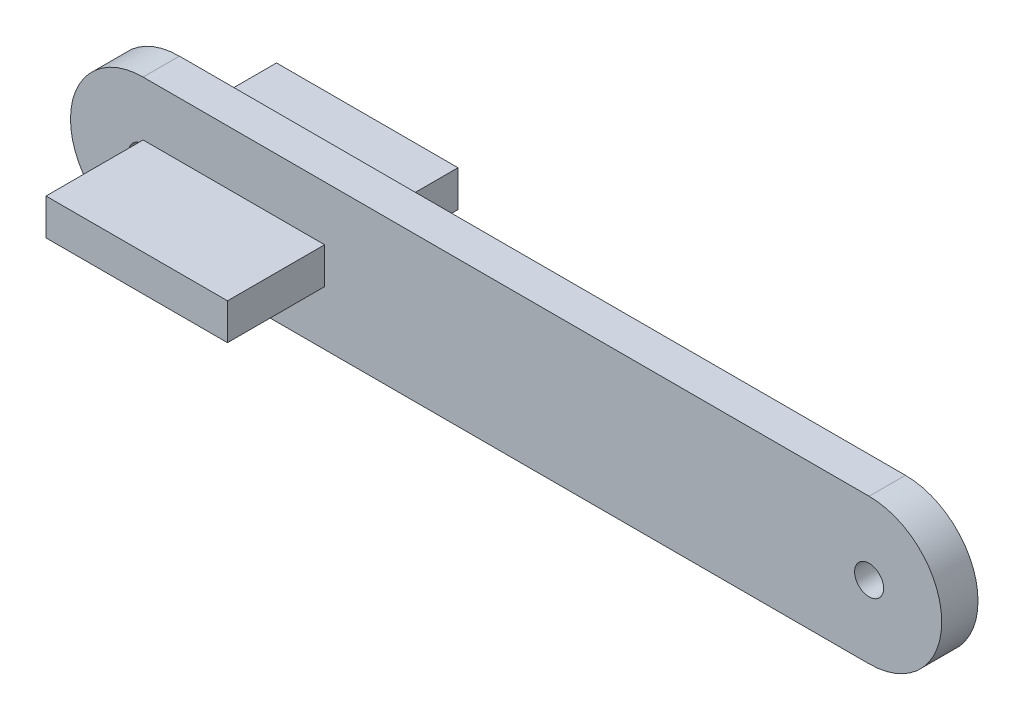
ISO-10303-21;
HEADER;
FILE_DESCRIPTION(('STEP AP214'),'2;1');
FILE_NAME('part.step','',(''),(''),'','','');
FILE_SCHEMA(('AUTOMOTIVE_DESIGN { 1 0 10303 214 1 1 1 1 }'));
ENDSEC;
DATA;
#1=APPLICATION_CONTEXT('core data for automotive mechanical design processes');
#2=APPLICATION_PROTOCOL_DEFINITION('international standard','automotive_design',2000,#1);
#3=PRODUCT_CONTEXT('',#1,'mechanical');
#4=PRODUCT('Part','Part','',(#3));
#5=PRODUCT_RELATED_PRODUCT_CATEGORY('part','',(#4));
#6=PRODUCT_DEFINITION_FORMATION('','',#4);
#7=PRODUCT_DEFINITION_CONTEXT('part definition',#1,'design');
#8=PRODUCT_DEFINITION('design','',#6,#7);
#9=PRODUCT_DEFINITION_SHAPE('','',#8);
#10=(LENGTH_UNIT() NAMED_UNIT(*) SI_UNIT(.MILLI.,.METRE.));
#11=(NAMED_UNIT(*) PLANE_ANGLE_UNIT() SI_UNIT($,.RADIAN.));
#12=(NAMED_UNIT(*) SI_UNIT($,.STERADIAN.) SOLID_ANGLE_UNIT());
#13=UNCERTAINTY_MEASURE_WITH_UNIT(LENGTH_MEASURE(1.E-05),#10,'distance_accuracy_value','');
#14=(GEOMETRIC_REPRESENTATION_CONTEXT(3) GLOBAL_UNCERTAINTY_ASSIGNED_CONTEXT((#13)) GLOBAL_UNIT_ASSIGNED_CONTEXT((#10,
#11,#12)) REPRESENTATION_CONTEXT('',''));
#15=CARTESIAN_POINT('',(0.,0.,0.));
#16=DIRECTION('',(0.,0.,1.));
#17=DIRECTION('',(1.,0.,0.));
#18=AXIS2_PLACEMENT_3D('',#15,#16,#17);
#19=CARTESIAN_POINT('',(-50.,0.,-2.5));
#20=DIRECTION('',(0.,0.,1.));
#21=DIRECTION('',(1.,0.,0.));
#22=AXIS2_PLACEMENT_3D('',#19,#20,#21);
#23=CYLINDRICAL_SURFACE('',#22,10.);
#24=DIRECTION('',(0.,0.,1.));
#25=VECTOR('',#24,1.);
#26=CARTESIAN_POINT('',(-50.,-9.99999999999999,-2.5));
#27=LINE('',#26,#25);
#28=CARTESIAN_POINT('',(-50.,-9.99999999999999,-2.5));
#29=VERTEX_POINT('',#28);
#30=CARTESIAN_POINT('',(-50.,-9.99999999999999,2.5));
#31=VERTEX_POINT('',#30);
#32=EDGE_CURVE('E212',#29,#31,#27,.T.);
#33=ORIENTED_EDGE('',*,*,#32,.T.);
#34=CARTESIAN_POINT('',(-50.,0.,2.5));
#35=DIRECTION('',(0.,0.,1.));
#36=DIRECTION('',(1.,0.,0.));
#37=AXIS2_PLACEMENT_3D('',#34,#35,#36);
#38=CIRCLE('',#37,10.);
#39=CARTESIAN_POINT('',(-50.,10.,2.5));
#40=VERTEX_POINT('',#39);
#41=EDGE_CURVE('E182',#40,#31,#38,.T.);
#42=ORIENTED_EDGE('',*,*,#41,.F.);
#43=DIRECTION('',(0.,0.,1.));
#44=VECTOR('',#43,1.);
#45=CARTESIAN_POINT('',(-50.,10.,-2.5));
#46=LINE('',#45,#44);
#47=CARTESIAN_POINT('',(-50.,10.,-2.5));
#48=VERTEX_POINT('',#47);
#49=EDGE_CURVE('E213',#48,#40,#46,.T.);
#50=ORIENTED_EDGE('',*,*,#49,.F.);
#51=CARTESIAN_POINT('',(-50.,0.,-2.5));
#52=DIRECTION('',(0.,0.,1.));
#53=DIRECTION('',(1.,0.,0.));
#54=AXIS2_PLACEMENT_3D('',#51,#52,#53);
#55=CIRCLE('',#54,10.);
#56=EDGE_CURVE('E200',#48,#29,#55,.T.);
#57=ORIENTED_EDGE('',*,*,#56,.T.);
#58=EDGE_LOOP('',(#33,#42,#50,#57));
#59=FACE_BOUND('',#58,.T.);
#60=ADVANCED_FACE('F33',(#59),#23,.T.);
#61=CARTESIAN_POINT('',(-50.,10.,-2.5));
#62=DIRECTION('',(0.,1.,0.));
#63=DIRECTION('',(0.,0.,1.));
#64=AXIS2_PLACEMENT_3D('',#61,#62,#63);
#65=PLANE('',#64);
#66=ORIENTED_EDGE('',*,*,#49,.T.);
#67=DIRECTION('',(-1.,0.,0.));
#68=VECTOR('',#67,1.);
#69=CARTESIAN_POINT('',(-50.,10.,2.5));
#70=LINE('',#69,#68);
#71=CARTESIAN_POINT('',(50.,10.,2.5));
#72=VERTEX_POINT('',#71);
#73=EDGE_CURVE('E191',#72,#40,#70,.T.);
#74=ORIENTED_EDGE('',*,*,#73,.F.);
#75=DIRECTION('',(0.,0.,1.));
#76=VECTOR('',#75,1.);
#77=CARTESIAN_POINT('',(50.,10.,-2.5));
#78=LINE('',#77,#76);
#79=CARTESIAN_POINT('',(50.,10.,-2.5));
#80=VERTEX_POINT('',#79);
#81=EDGE_CURVE('E215',#80,#72,#78,.T.);
#82=ORIENTED_EDGE('',*,*,#81,.F.);
#83=DIRECTION('',(-1.,0.,0.));
#84=VECTOR('',#83,1.);
#85=CARTESIAN_POINT('',(-50.,10.,-2.5));
#86=LINE('',#85,#84);
#87=EDGE_CURVE('E209',#80,#48,#86,.T.);
#88=ORIENTED_EDGE('',*,*,#87,.T.);
#89=EDGE_LOOP('',(#66,#74,#82,#88));
#90=FACE_BOUND('',#89,.T.);
#91=ADVANCED_FACE('F280',(#90),#65,.T.);
#92=CARTESIAN_POINT('',(50.,0.,-2.5));
#93=DIRECTION('',(0.,0.,1.));
#94=DIRECTION('',(1.,0.,0.));
#95=AXIS2_PLACEMENT_3D('',#92,#93,#94);
#96=CYLINDRICAL_SURFACE('',#95,10.);
#97=ORIENTED_EDGE('',*,*,#81,.T.);
#98=CARTESIAN_POINT('',(50.,0.,2.5));
#99=DIRECTION('',(0.,0.,1.));
#100=DIRECTION('',(1.,0.,0.));
#101=AXIS2_PLACEMENT_3D('',#98,#99,#100);
#102=CIRCLE('',#101,10.);
#103=CARTESIAN_POINT('',(50.,-10.,2.5));
#104=VERTEX_POINT('',#103);
#105=EDGE_CURVE('E188',#104,#72,#102,.T.);
#106=ORIENTED_EDGE('',*,*,#105,.F.);
#107=DIRECTION('',(0.,0.,1.));
#108=VECTOR('',#107,1.);
#109=CARTESIAN_POINT('',(50.,-10.,-2.5));
#110=LINE('',#109,#108);
#111=CARTESIAN_POINT('',(50.,-10.,-2.5));
#112=VERTEX_POINT('',#111);
#113=EDGE_CURVE('E217',#112,#104,#110,.T.);
#114=ORIENTED_EDGE('',*,*,#113,.F.);
#115=CARTESIAN_POINT('',(50.,0.,-2.5));
#116=DIRECTION('',(0.,0.,1.));
#117=DIRECTION('',(1.,0.,0.));
#118=AXIS2_PLACEMENT_3D('',#115,#116,#117);
#119=CIRCLE('',#118,10.);
#120=EDGE_CURVE('E206',#112,#80,#119,.T.);
#121=ORIENTED_EDGE('',*,*,#120,.T.);
#122=EDGE_LOOP('',(#97,#106,#114,#121));
#123=FACE_BOUND('',#122,.T.);
#124=ADVANCED_FACE('F285',(#123),#96,.T.);
#125=CARTESIAN_POINT('',(-50.,-9.99999999999999,-2.5));
#126=DIRECTION('',(0.,-1.,0.));
#127=DIRECTION('',(0.,0.,-1.));
#128=AXIS2_PLACEMENT_3D('',#125,#126,#127);
#129=PLANE('',#128);
#130=ORIENTED_EDGE('',*,*,#113,.T.);
#131=DIRECTION('',(1.,0.,0.));
#132=VECTOR('',#131,1.);
#133=CARTESIAN_POINT('',(-50.,-9.99999999999999,2.5));
#134=LINE('',#133,#132);
#135=EDGE_CURVE('E185',#31,#104,#134,.T.);
#136=ORIENTED_EDGE('',*,*,#135,.F.);
#137=ORIENTED_EDGE('',*,*,#32,.F.);
#138=DIRECTION('',(1.,0.,0.));
#139=VECTOR('',#138,1.);
#140=CARTESIAN_POINT('',(-50.,-9.99999999999999,-2.5));
#141=LINE('',#140,#139);
#142=EDGE_CURVE('E203',#29,#112,#141,.T.);
#143=ORIENTED_EDGE('',*,*,#142,.T.);
#144=EDGE_LOOP('',(#130,#136,#137,#143));
#145=FACE_BOUND('',#144,.T.);
#146=ADVANCED_FACE('F293',(#145),#129,.T.);
#147=CARTESIAN_POINT('',(-50.,0.,-2.5));
#148=DIRECTION('',(0.,0.,1.));
#149=DIRECTION('',(1.,0.,0.));
#150=AXIS2_PLACEMENT_3D('',#147,#148,#149);
#151=PLANE('',#150);
#152=CARTESIAN_POINT('',(50.,0.,-2.5));
#153=DIRECTION('',(0.,0.,1.));
#154=DIRECTION('',(1.,0.,0.));
#155=AXIS2_PLACEMENT_3D('',#152,#153,#154);
#156=CIRCLE('',#155,2.);
#157=CARTESIAN_POINT('',(52.,0.,-2.5));
#158=VERTEX_POINT('',#157);
#159=EDGE_CURVE('E194',#158,#158,#156,.T.);
#160=ORIENTED_EDGE('',*,*,#159,.T.);
#161=EDGE_LOOP('',(#160));
#162=FACE_BOUND('',#161,.T.);
#163=DIRECTION('',(1.,0.,0.));
#164=VECTOR('',#163,1.);
#165=CARTESIAN_POINT('',(-50.,2.5,-2.5));
#166=LINE('',#165,#164);
#167=CARTESIAN_POINT('',(-50.,2.5,-2.5));
#168=VERTEX_POINT('',#167);
#169=CARTESIAN_POINT('',(-25.,2.5,-2.5));
#170=VERTEX_POINT('',#169);
#171=EDGE_CURVE('E49',#168,#170,#166,.T.);
#172=ORIENTED_EDGE('',*,*,#171,.F.);
#173=DIRECTION('',(0.,-1.,0.));
#174=VECTOR('',#173,1.);
#175=CARTESIAN_POINT('',(-50.,0.,-2.5));
#176=LINE('',#175,#174);
#177=CARTESIAN_POINT('',(-50.,2.,-2.5));
#178=VERTEX_POINT('',#177);
#179=EDGE_CURVE('E169',#168,#178,#176,.T.);
#180=ORIENTED_EDGE('',*,*,#179,.T.);
#181=CARTESIAN_POINT('',(-50.,0.,-2.5));
#182=DIRECTION('',(0.,0.,1.));
#183=DIRECTION('',(1.,0.,0.));
#184=AXIS2_PLACEMENT_3D('',#181,#182,#183);
#185=CIRCLE('',#184,2.);
#186=CARTESIAN_POINT('',(-50.,-2.,-2.5));
#187=VERTEX_POINT('',#186);
#188=EDGE_CURVE('E197',#178,#187,#185,.T.);
#189=ORIENTED_EDGE('',*,*,#188,.T.);
#190=CARTESIAN_POINT('',(-50.,-2.5,-2.5));
#191=VERTEX_POINT('',#190);
#192=EDGE_CURVE('E160',#187,#191,#176,.T.);
#193=ORIENTED_EDGE('',*,*,#192,.T.);
#194=DIRECTION('',(-1.,0.,0.));
#195=VECTOR('',#194,1.);
#196=CARTESIAN_POINT('',(-50.,-2.5,-2.5));
#197=LINE('',#196,#195);
#198=CARTESIAN_POINT('',(-25.,-2.5,-2.5));
#199=VERTEX_POINT('',#198);
#200=EDGE_CURVE('E172',#199,#191,#197,.T.);
#201=ORIENTED_EDGE('',*,*,#200,.F.);
#202=DIRECTION('',(0.,-1.,0.));
#203=VECTOR('',#202,1.);
#204=CARTESIAN_POINT('',(-25.,0.,-2.5));
#205=LINE('',#204,#203);
#206=EDGE_CURVE('E54',#170,#199,#205,.T.);
#207=ORIENTED_EDGE('',*,*,#206,.F.);
#208=EDGE_LOOP('',(#172,#180,#189,#193,#201,#207));
#209=FACE_BOUND('',#208,.T.);
#210=ORIENTED_EDGE('',*,*,#56,.F.);
#211=ORIENTED_EDGE('',*,*,#87,.F.);
#212=ORIENTED_EDGE('',*,*,#120,.F.);
#213=ORIENTED_EDGE('',*,*,#142,.F.);
#214=EDGE_LOOP('',(#210,#211,#212,#213));
#215=FACE_BOUND('',#214,.T.);
#216=ADVANCED_FACE('F299',(#162,#209,#215),#151,.F.);
#217=CARTESIAN_POINT('',(-50.,0.,-2.5));
#218=DIRECTION('',(0.,0.,1.));
#219=DIRECTION('',(1.,0.,0.));
#220=AXIS2_PLACEMENT_3D('',#217,#218,#219);
#221=CYLINDRICAL_SURFACE('',#220,2.);
#222=CARTESIAN_POINT('',(-50.,0.,2.5));
#223=DIRECTION('',(0.,0.,1.));
#224=DIRECTION('',(1.,0.,0.));
#225=AXIS2_PLACEMENT_3D('',#222,#223,#224);
#226=CIRCLE('',#225,2.);
#227=CARTESIAN_POINT('',(-50.,2.,2.5));
#228=VERTEX_POINT('',#227);
#229=CARTESIAN_POINT('',(-50.,-2.,2.5));
#230=VERTEX_POINT('',#229);
#231=EDGE_CURVE('E179',#228,#230,#226,.T.);
#232=ORIENTED_EDGE('',*,*,#231,.T.);
#233=DIRECTION('',(0.,0.,1.));
#234=VECTOR('',#233,1.);
#235=CARTESIAN_POINT('',(-50.,-2.,-2.5));
#236=LINE('',#235,#234);
#237=EDGE_CURVE('E157',#230,#187,#236,.F.);
#238=ORIENTED_EDGE('',*,*,#237,.T.);
#239=ORIENTED_EDGE('',*,*,#188,.F.);
#240=DIRECTION('',(0.,0.,1.));
#241=VECTOR('',#240,1.);
#242=CARTESIAN_POINT('',(-50.,2.,-2.5));
#243=LINE('',#242,#241);
#244=EDGE_CURVE('E168',#178,#228,#243,.T.);
#245=ORIENTED_EDGE('',*,*,#244,.T.);
#246=EDGE_LOOP('',(#232,#238,#239,#245));
#247=FACE_BOUND('',#246,.T.);
#248=ADVANCED_FACE('F266',(#247),#221,.F.);
#249=CARTESIAN_POINT('',(50.,0.,-2.5));
#250=DIRECTION('',(0.,0.,1.));
#251=DIRECTION('',(1.,0.,0.));
#252=AXIS2_PLACEMENT_3D('',#249,#250,#251);
#253=CYLINDRICAL_SURFACE('',#252,2.);
#254=ORIENTED_EDGE('',*,*,#159,.F.);
#255=EDGE_LOOP('',(#254));
#256=FACE_BOUND('',#255,.T.);
#257=CARTESIAN_POINT('',(50.,0.,2.5));
#258=DIRECTION('',(0.,0.,1.));
#259=DIRECTION('',(1.,0.,0.));
#260=AXIS2_PLACEMENT_3D('',#257,#258,#259);
#261=CIRCLE('',#260,2.);
#262=CARTESIAN_POINT('',(52.,0.,2.5));
#263=VERTEX_POINT('',#262);
#264=EDGE_CURVE('E176',#263,#263,#261,.T.);
#265=ORIENTED_EDGE('',*,*,#264,.T.);
#266=EDGE_LOOP('',(#265));
#267=FACE_BOUND('',#266,.T.);
#268=ADVANCED_FACE('F313',(#256,#267),#253,.F.);
#269=CARTESIAN_POINT('',(-50.,0.,2.5));
#270=DIRECTION('',(0.,0.,1.));
#271=DIRECTION('',(1.,0.,0.));
#272=AXIS2_PLACEMENT_3D('',#269,#270,#271);
#273=PLANE('',#272);
#274=DIRECTION('',(0.,-1.,0.));
#275=VECTOR('',#274,1.);
#276=CARTESIAN_POINT('',(-50.,0.,2.5));
#277=LINE('',#276,#275);
#278=CARTESIAN_POINT('',(-50.,2.5,2.5));
#279=VERTEX_POINT('',#278);
#280=EDGE_CURVE('E11',#279,#228,#277,.T.);
#281=ORIENTED_EDGE('',*,*,#280,.F.);
#282=DIRECTION('',(1.,0.,0.));
#283=VECTOR('',#282,1.);
#284=CARTESIAN_POINT('',(-50.,2.5,2.5));
#285=LINE('',#284,#283);
#286=CARTESIAN_POINT('',(-25.,2.5,2.5));
#287=VERTEX_POINT('',#286);
#288=EDGE_CURVE('E36',#279,#287,#285,.T.);
#289=ORIENTED_EDGE('',*,*,#288,.T.);
#290=DIRECTION('',(0.,-1.,0.));
#291=VECTOR('',#290,1.);
#292=CARTESIAN_POINT('',(-25.,0.,2.5));
#293=LINE('',#292,#291);
#294=CARTESIAN_POINT('',(-25.,-2.5,2.5));
#295=VERTEX_POINT('',#294);
#296=EDGE_CURVE('E222',#287,#295,#293,.T.);
#297=ORIENTED_EDGE('',*,*,#296,.T.);
#298=DIRECTION('',(-1.,0.,0.));
#299=VECTOR('',#298,1.);
#300=CARTESIAN_POINT('',(-50.,-2.5,2.5));
#301=LINE('',#300,#299);
#302=CARTESIAN_POINT('',(-50.,-2.5,2.5));
#303=VERTEX_POINT('',#302);
#304=EDGE_CURVE('E221',#295,#303,#301,.T.);
#305=ORIENTED_EDGE('',*,*,#304,.T.);
#306=EDGE_CURVE('E42',#230,#303,#277,.T.);
#307=ORIENTED_EDGE('',*,*,#306,.F.);
#308=ORIENTED_EDGE('',*,*,#231,.F.);
#309=EDGE_LOOP('',(#281,#289,#297,#305,#307,#308));
#310=FACE_BOUND('',#309,.T.);
#311=ORIENTED_EDGE('',*,*,#41,.T.);
#312=ORIENTED_EDGE('',*,*,#135,.T.);
#313=ORIENTED_EDGE('',*,*,#105,.T.);
#314=ORIENTED_EDGE('',*,*,#73,.T.);
#315=EDGE_LOOP('',(#311,#312,#313,#314));
#316=FACE_BOUND('',#315,.T.);
#317=ORIENTED_EDGE('',*,*,#264,.F.);
#318=EDGE_LOOP('',(#317));
#319=FACE_BOUND('',#318,.T.);
#320=ADVANCED_FACE('F227',(#310,#316,#319),#273,.T.);
#321=CARTESIAN_POINT('',(-25.,2.5,15.875));
#322=DIRECTION('',(0.,-1.,0.));
#323=DIRECTION('',(0.,0.,-1.));
#324=AXIS2_PLACEMENT_3D('',#321,#322,#323);
#325=PLANE('',#324);
#326=DIRECTION('',(0.,0.,1.));
#327=VECTOR('',#326,1.);
#328=CARTESIAN_POINT('',(-50.,2.5,15.875));
#329=LINE('',#328,#327);
#330=CARTESIAN_POINT('',(-50.,2.5,-15.875));
#331=VERTEX_POINT('',#330);
#332=EDGE_CURVE('E247',#331,#168,#329,.T.);
#333=ORIENTED_EDGE('',*,*,#332,.T.);
#334=ORIENTED_EDGE('',*,*,#171,.T.);
#335=DIRECTION('',(0.,0.,1.));
#336=VECTOR('',#335,1.);
#337=CARTESIAN_POINT('',(-25.,2.5,15.875));
#338=LINE('',#337,#336);
#339=CARTESIAN_POINT('',(-25.,2.5,-15.875));
#340=VERTEX_POINT('',#339);
#341=EDGE_CURVE('E133',#340,#170,#338,.T.);
#342=ORIENTED_EDGE('',*,*,#341,.F.);
#343=DIRECTION('',(-1.,0.,0.));
#344=VECTOR('',#343,1.);
#345=CARTESIAN_POINT('',(-25.,2.5,-15.875));
#346=LINE('',#345,#344);
#347=EDGE_CURVE('E138',#340,#331,#346,.T.);
#348=ORIENTED_EDGE('',*,*,#347,.T.);
#349=EDGE_LOOP('',(#333,#334,#342,#348));
#350=FACE_BOUND('',#349,.T.);
#351=ADVANCED_FACE('F136',(#350),#325,.F.);
#352=CARTESIAN_POINT('',(-25.,-2.5,15.875));
#353=DIRECTION('',(0.,1.,0.));
#354=DIRECTION('',(0.,0.,1.));
#355=AXIS2_PLACEMENT_3D('',#352,#353,#354);
#356=PLANE('',#355);
#357=DIRECTION('',(0.,0.,-1.));
#358=VECTOR('',#357,1.);
#359=CARTESIAN_POINT('',(-25.,-2.5,15.875));
#360=LINE('',#359,#358);
#361=CARTESIAN_POINT('',(-25.,-2.5,-15.875));
#362=VERTEX_POINT('',#361);
#363=EDGE_CURVE('E148',#199,#362,#360,.T.);
#364=ORIENTED_EDGE('',*,*,#363,.F.);
#365=ORIENTED_EDGE('',*,*,#200,.T.);
#366=DIRECTION('',(0.,0.,-1.));
#367=VECTOR('',#366,1.);
#368=CARTESIAN_POINT('',(-50.,-2.5,15.875));
#369=LINE('',#368,#367);
#370=CARTESIAN_POINT('',(-50.,-2.5,-15.875));
#371=VERTEX_POINT('',#370);
#372=EDGE_CURVE('E251',#191,#371,#369,.T.);
#373=ORIENTED_EDGE('',*,*,#372,.T.);
#374=DIRECTION('',(-1.,0.,0.));
#375=VECTOR('',#374,1.);
#376=CARTESIAN_POINT('',(-25.,-2.5,-15.875));
#377=LINE('',#376,#375);
#378=EDGE_CURVE('E244',#362,#371,#377,.T.);
#379=ORIENTED_EDGE('',*,*,#378,.F.);
#380=EDGE_LOOP('',(#364,#365,#373,#379));
#381=FACE_BOUND('',#380,.T.);
#382=ADVANCED_FACE('F277',(#381),#356,.F.);
#383=CARTESIAN_POINT('',(-25.,0.,0.));
#384=DIRECTION('',(-1.,0.,0.));
#385=DIRECTION('',(0.,0.,1.));
#386=AXIS2_PLACEMENT_3D('',#383,#384,#385);
#387=PLANE('',#386);
#388=ORIENTED_EDGE('',*,*,#341,.T.);
#389=ORIENTED_EDGE('',*,*,#206,.T.);
#390=ORIENTED_EDGE('',*,*,#363,.T.);
#391=DIRECTION('',(0.,1.,0.));
#392=VECTOR('',#391,1.);
#393=CARTESIAN_POINT('',(-25.,-2.5,-15.875));
#394=LINE('',#393,#392);
#395=EDGE_CURVE('E145',#362,#340,#394,.T.);
#396=ORIENTED_EDGE('',*,*,#395,.T.);
#397=EDGE_LOOP('',(#388,#389,#390,#396));
#398=FACE_BOUND('',#397,.T.);
#399=ADVANCED_FACE('F146',(#398),#387,.F.);
#400=CARTESIAN_POINT('',(-50.,0.,0.));
#401=DIRECTION('',(-1.,0.,0.));
#402=DIRECTION('',(0.,0.,1.));
#403=AXIS2_PLACEMENT_3D('',#400,#401,#402);
#404=PLANE('',#403);
#405=ORIENTED_EDGE('',*,*,#179,.F.);
#406=ORIENTED_EDGE('',*,*,#332,.F.);
#407=DIRECTION('',(0.,1.,0.));
#408=VECTOR('',#407,1.);
#409=CARTESIAN_POINT('',(-50.,-2.5,-15.875));
#410=LINE('',#409,#408);
#411=EDGE_CURVE('E156',#371,#331,#410,.T.);
#412=ORIENTED_EDGE('',*,*,#411,.F.);
#413=ORIENTED_EDGE('',*,*,#372,.F.);
#414=ORIENTED_EDGE('',*,*,#192,.F.);
#415=ORIENTED_EDGE('',*,*,#237,.F.);
#416=ORIENTED_EDGE('',*,*,#306,.T.);
#417=CARTESIAN_POINT('',(-50.,-2.5,15.875));
#418=VERTEX_POINT('',#417);
#419=EDGE_CURVE('E152',#418,#303,#369,.T.);
#420=ORIENTED_EDGE('',*,*,#419,.F.);
#421=DIRECTION('',(0.,-1.,0.));
#422=VECTOR('',#421,1.);
#423=CARTESIAN_POINT('',(-50.,-2.5,15.875));
#424=LINE('',#423,#422);
#425=CARTESIAN_POINT('',(-50.,2.5,15.875));
#426=VERTEX_POINT('',#425);
#427=EDGE_CURVE('E249',#426,#418,#424,.T.);
#428=ORIENTED_EDGE('',*,*,#427,.F.);
#429=EDGE_CURVE('E246',#279,#426,#329,.T.);
#430=ORIENTED_EDGE('',*,*,#429,.F.);
#431=ORIENTED_EDGE('',*,*,#280,.T.);
#432=ORIENTED_EDGE('',*,*,#244,.F.);
#433=EDGE_LOOP('',(#405,#406,#412,#413,#414,#415,#416,#420,#428,#430,#431,#432));
#434=FACE_BOUND('',#433,.T.);
#435=ADVANCED_FACE('F262',(#434),#404,.T.);
#436=CARTESIAN_POINT('',(-25.,-2.5,-15.875));
#437=DIRECTION('',(0.,0.,1.));
#438=DIRECTION('',(1.,0.,0.));
#439=AXIS2_PLACEMENT_3D('',#436,#437,#438);
#440=PLANE('',#439);
#441=ORIENTED_EDGE('',*,*,#411,.T.);
#442=ORIENTED_EDGE('',*,*,#347,.F.);
#443=ORIENTED_EDGE('',*,*,#395,.F.);
#444=ORIENTED_EDGE('',*,*,#378,.T.);
#445=EDGE_LOOP('',(#441,#442,#443,#444));
#446=FACE_BOUND('',#445,.T.);
#447=ADVANCED_FACE('F154',(#446),#440,.F.);
#448=ORIENTED_EDGE('',*,*,#288,.F.);
#449=ORIENTED_EDGE('',*,*,#429,.T.);
#450=DIRECTION('',(-1.,0.,0.));
#451=VECTOR('',#450,1.);
#452=CARTESIAN_POINT('',(-25.,2.5,15.875));
#453=LINE('',#452,#451);
#454=CARTESIAN_POINT('',(-25.,2.5,15.875));
#455=VERTEX_POINT('',#454);
#456=EDGE_CURVE('E158',#455,#426,#453,.T.);
#457=ORIENTED_EDGE('',*,*,#456,.F.);
#458=EDGE_CURVE('E142',#287,#455,#338,.T.);
#459=ORIENTED_EDGE('',*,*,#458,.F.);
#460=EDGE_LOOP('',(#448,#449,#457,#459));
#461=FACE_BOUND('',#460,.T.);
#462=ADVANCED_FACE('F239',(#461),#325,.F.);
#463=CARTESIAN_POINT('',(-25.,-2.5,15.875));
#464=DIRECTION('',(0.,0.,-1.));
#465=DIRECTION('',(-1.,0.,0.));
#466=AXIS2_PLACEMENT_3D('',#463,#464,#465);
#467=PLANE('',#466);
#468=ORIENTED_EDGE('',*,*,#427,.T.);
#469=DIRECTION('',(-1.,0.,0.));
#470=VECTOR('',#469,1.);
#471=CARTESIAN_POINT('',(-25.,-2.5,15.875));
#472=LINE('',#471,#470);
#473=CARTESIAN_POINT('',(-25.,-2.5,15.875));
#474=VERTEX_POINT('',#473);
#475=EDGE_CURVE('E163',#474,#418,#472,.T.);
#476=ORIENTED_EDGE('',*,*,#475,.F.);
#477=DIRECTION('',(0.,-1.,0.));
#478=VECTOR('',#477,1.);
#479=CARTESIAN_POINT('',(-25.,-2.5,15.875));
#480=LINE('',#479,#478);
#481=EDGE_CURVE('E141',#455,#474,#480,.T.);
#482=ORIENTED_EDGE('',*,*,#481,.F.);
#483=ORIENTED_EDGE('',*,*,#456,.T.);
#484=EDGE_LOOP('',(#468,#476,#482,#483));
#485=FACE_BOUND('',#484,.T.);
#486=ADVANCED_FACE('F269',(#485),#467,.F.);
#487=ORIENTED_EDGE('',*,*,#304,.F.);
#488=EDGE_CURVE('E238',#474,#295,#360,.T.);
#489=ORIENTED_EDGE('',*,*,#488,.F.);
#490=ORIENTED_EDGE('',*,*,#475,.T.);
#491=ORIENTED_EDGE('',*,*,#419,.T.);
#492=EDGE_LOOP('',(#487,#489,#490,#491));
#493=FACE_BOUND('',#492,.T.);
#494=ADVANCED_FACE('F258',(#493),#356,.F.);
#495=ORIENTED_EDGE('',*,*,#296,.F.);
#496=ORIENTED_EDGE('',*,*,#458,.T.);
#497=ORIENTED_EDGE('',*,*,#481,.T.);
#498=ORIENTED_EDGE('',*,*,#488,.T.);
#499=EDGE_LOOP('',(#495,#496,#497,#498));
#500=FACE_BOUND('',#499,.T.);
#501=ADVANCED_FACE('F235',(#500),#387,.F.);
#502=CLOSED_SHELL('',(#60,#91,#124,#146,#216,#248,#268,#320,#351,#382,#399,#435,#447,#462,#486,
#494,#501));
#503=MANIFOLD_SOLID_BREP('B2',#502);
#504=ADVANCED_BREP_SHAPE_REPRESENTATION('',(#18,#503),#14);
#505=SHAPE_DEFINITION_REPRESENTATION(#9,#504);
ENDSEC;
END-ISO-10303-21;
